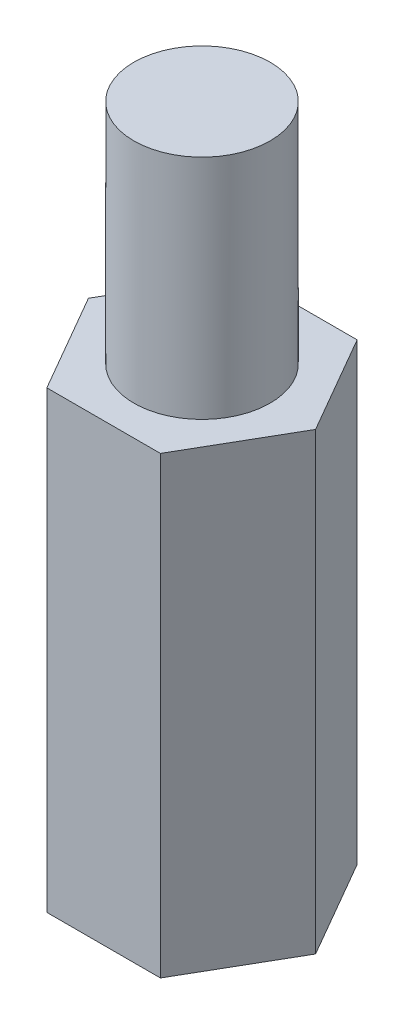
ISO-10303-21;
HEADER;
FILE_DESCRIPTION(('STEP AP214'),'2;1');
FILE_NAME('part.step','',(''),(''),'','','');
FILE_SCHEMA(('AUTOMOTIVE_DESIGN { 1 0 10303 214 1 1 1 1 }'));
ENDSEC;
DATA;
#1=APPLICATION_CONTEXT('core data for automotive mechanical design processes');
#2=APPLICATION_PROTOCOL_DEFINITION('international standard','automotive_design',2000,#1);
#3=PRODUCT_CONTEXT('',#1,'mechanical');
#4=PRODUCT('Part','Part','',(#3));
#5=PRODUCT_RELATED_PRODUCT_CATEGORY('part','',(#4));
#6=PRODUCT_DEFINITION_FORMATION('','',#4);
#7=PRODUCT_DEFINITION_CONTEXT('part definition',#1,'design');
#8=PRODUCT_DEFINITION('design','',#6,#7);
#9=PRODUCT_DEFINITION_SHAPE('','',#8);
#10=(LENGTH_UNIT() NAMED_UNIT(*) SI_UNIT(.MILLI.,.METRE.));
#11=(NAMED_UNIT(*) PLANE_ANGLE_UNIT() SI_UNIT($,.RADIAN.));
#12=(NAMED_UNIT(*) SI_UNIT($,.STERADIAN.) SOLID_ANGLE_UNIT());
#13=UNCERTAINTY_MEASURE_WITH_UNIT(LENGTH_MEASURE(1.E-05),#10,'distance_accuracy_value','');
#14=(GEOMETRIC_REPRESENTATION_CONTEXT(3) GLOBAL_UNCERTAINTY_ASSIGNED_CONTEXT((#13)) GLOBAL_UNIT_ASSIGNED_CONTEXT((#10,
#11,#12)) REPRESENTATION_CONTEXT('',''));
#15=CARTESIAN_POINT('',(0.,0.,0.));
#16=DIRECTION('',(0.,0.,1.));
#17=DIRECTION('',(1.,0.,0.));
#18=AXIS2_PLACEMENT_3D('',#15,#16,#17);
#19=CARTESIAN_POINT('',(0.,10.,0.));
#20=DIRECTION('',(0.,1.,0.));
#21=DIRECTION('',(0.,0.,1.));
#22=AXIS2_PLACEMENT_3D('',#19,#20,#21);
#23=PLANE('',#22);
#24=DIRECTION('',(1.,0.,0.));
#25=VECTOR('',#24,1.);
#26=CARTESIAN_POINT('',(-1.25,10.,2.1650635094611));
#27=LINE('',#26,#25);
#28=CARTESIAN_POINT('',(-1.25,10.,2.1650635094611));
#29=VERTEX_POINT('',#28);
#30=CARTESIAN_POINT('',(1.25,10.,2.1650635094611));
#31=VERTEX_POINT('',#30);
#32=EDGE_CURVE('E91',#29,#31,#27,.T.);
#33=ORIENTED_EDGE('',*,*,#32,.T.);
#34=DIRECTION('',(0.5,0.,-0.866025403784439));
#35=VECTOR('',#34,1.);
#36=CARTESIAN_POINT('',(1.25,10.,2.1650635094611));
#37=LINE('',#36,#35);
#38=CARTESIAN_POINT('',(2.5,10.,0.));
#39=VERTEX_POINT('',#38);
#40=EDGE_CURVE('E84',#31,#39,#37,.T.);
#41=ORIENTED_EDGE('',*,*,#40,.T.);
#42=DIRECTION('',(-0.499999999999999,0.,-0.866025403784439));
#43=VECTOR('',#42,1.);
#44=CARTESIAN_POINT('',(2.5,10.,0.));
#45=LINE('',#44,#43);
#46=CARTESIAN_POINT('',(1.25,10.,-2.1650635094611));
#47=VERTEX_POINT('',#46);
#48=EDGE_CURVE('E88',#39,#47,#45,.T.);
#49=ORIENTED_EDGE('',*,*,#48,.T.);
#50=DIRECTION('',(-1.,0.,0.));
#51=VECTOR('',#50,1.);
#52=CARTESIAN_POINT('',(1.25,10.,-2.1650635094611));
#53=LINE('',#52,#51);
#54=CARTESIAN_POINT('',(-1.25,10.,-2.1650635094611));
#55=VERTEX_POINT('',#54);
#56=EDGE_CURVE('E107',#47,#55,#53,.T.);
#57=ORIENTED_EDGE('',*,*,#56,.T.);
#58=DIRECTION('',(-0.5,0.,0.866025403784438));
#59=VECTOR('',#58,1.);
#60=CARTESIAN_POINT('',(-1.25,10.,-2.1650635094611));
#61=LINE('',#60,#59);
#62=CARTESIAN_POINT('',(-2.5,10.,0.));
#63=VERTEX_POINT('',#62);
#64=EDGE_CURVE('E109',#55,#63,#61,.T.);
#65=ORIENTED_EDGE('',*,*,#64,.T.);
#66=DIRECTION('',(0.499999999999999,0.,0.866025403784439));
#67=VECTOR('',#66,1.);
#68=CARTESIAN_POINT('',(-2.5,10.,0.));
#69=LINE('',#68,#67);
#70=EDGE_CURVE('E114',#63,#29,#69,.T.);
#71=ORIENTED_EDGE('',*,*,#70,.T.);
#72=EDGE_LOOP('',(#33,#41,#49,#57,#65,#71));
#73=FACE_BOUND('',#72,.T.);
#74=CARTESIAN_POINT('',(0.,10.,0.));
#75=DIRECTION('',(0.,-1.,0.));
#76=DIRECTION('',(0.,0.,-1.));
#77=AXIS2_PLACEMENT_3D('',#74,#75,#76);
#78=CIRCLE('',#77,1.5);
#79=CARTESIAN_POINT('',(0.,10.,-1.5));
#80=VERTEX_POINT('',#79);
#81=EDGE_CURVE('E45',#80,#80,#78,.T.);
#82=ORIENTED_EDGE('',*,*,#81,.T.);
#83=EDGE_LOOP('',(#82));
#84=FACE_BOUND('',#83,.T.);
#85=ADVANCED_FACE('F41',(#73,#84),#23,.T.);
#86=CARTESIAN_POINT('',(-1.25,10.,2.1650635094611));
#87=DIRECTION('',(0.,0.,-1.));
#88=DIRECTION('',(-1.,0.,0.));
#89=AXIS2_PLACEMENT_3D('',#86,#87,#88);
#90=PLANE('',#89);
#91=DIRECTION('',(1.,0.,0.));
#92=VECTOR('',#91,1.);
#93=CARTESIAN_POINT('',(-1.25,0.,2.1650635094611));
#94=LINE('',#93,#92);
#95=CARTESIAN_POINT('',(-1.25,0.,2.1650635094611));
#96=VERTEX_POINT('',#95);
#97=CARTESIAN_POINT('',(1.25,0.,2.1650635094611));
#98=VERTEX_POINT('',#97);
#99=EDGE_CURVE('E116',#96,#98,#94,.T.);
#100=ORIENTED_EDGE('',*,*,#99,.T.);
#101=DIRECTION('',(0.,-1.,0.));
#102=VECTOR('',#101,1.);
#103=CARTESIAN_POINT('',(1.25,10.,2.1650635094611));
#104=LINE('',#103,#102);
#105=EDGE_CURVE('E121',#31,#98,#104,.T.);
#106=ORIENTED_EDGE('',*,*,#105,.F.);
#107=ORIENTED_EDGE('',*,*,#32,.F.);
#108=DIRECTION('',(0.,-1.,0.));
#109=VECTOR('',#108,1.);
#110=CARTESIAN_POINT('',(-1.25,10.,2.1650635094611));
#111=LINE('',#110,#109);
#112=EDGE_CURVE('E119',#29,#96,#111,.T.);
#113=ORIENTED_EDGE('',*,*,#112,.T.);
#114=EDGE_LOOP('',(#100,#106,#107,#113));
#115=FACE_BOUND('',#114,.T.);
#116=ADVANCED_FACE('F139',(#115),#90,.F.);
#117=CARTESIAN_POINT('',(1.25,10.,2.1650635094611));
#118=DIRECTION('',(-0.866025403784439,0.,-0.5));
#119=DIRECTION('',(-0.5,0.,0.866025403784439));
#120=AXIS2_PLACEMENT_3D('',#117,#118,#119);
#121=PLANE('',#120);
#122=DIRECTION('',(0.5,0.,-0.866025403784439));
#123=VECTOR('',#122,1.);
#124=CARTESIAN_POINT('',(1.25,0.,2.1650635094611));
#125=LINE('',#124,#123);
#126=CARTESIAN_POINT('',(2.5,0.,0.));
#127=VERTEX_POINT('',#126);
#128=EDGE_CURVE('E59',#98,#127,#125,.T.);
#129=ORIENTED_EDGE('',*,*,#128,.T.);
#130=DIRECTION('',(0.,-1.,0.));
#131=VECTOR('',#130,1.);
#132=CARTESIAN_POINT('',(2.5,10.,0.));
#133=LINE('',#132,#131);
#134=EDGE_CURVE('E96',#39,#127,#133,.T.);
#135=ORIENTED_EDGE('',*,*,#134,.F.);
#136=ORIENTED_EDGE('',*,*,#40,.F.);
#137=ORIENTED_EDGE('',*,*,#105,.T.);
#138=EDGE_LOOP('',(#129,#135,#136,#137));
#139=FACE_BOUND('',#138,.T.);
#140=ADVANCED_FACE('F97',(#139),#121,.F.);
#141=CARTESIAN_POINT('',(2.5,10.,0.));
#142=DIRECTION('',(-0.866025403784439,0.,0.499999999999999));
#143=DIRECTION('',(0.499999999999999,0.,0.866025403784439));
#144=AXIS2_PLACEMENT_3D('',#141,#142,#143);
#145=PLANE('',#144);
#146=DIRECTION('',(-0.499999999999999,0.,-0.866025403784439));
#147=VECTOR('',#146,1.);
#148=CARTESIAN_POINT('',(2.5,0.,0.));
#149=LINE('',#148,#147);
#150=CARTESIAN_POINT('',(1.25,0.,-2.1650635094611));
#151=VERTEX_POINT('',#150);
#152=EDGE_CURVE('E101',#127,#151,#149,.T.);
#153=ORIENTED_EDGE('',*,*,#152,.T.);
#154=DIRECTION('',(0.,-1.,0.));
#155=VECTOR('',#154,1.);
#156=CARTESIAN_POINT('',(1.25,10.,-2.1650635094611));
#157=LINE('',#156,#155);
#158=EDGE_CURVE('E105',#47,#151,#157,.T.);
#159=ORIENTED_EDGE('',*,*,#158,.F.);
#160=ORIENTED_EDGE('',*,*,#48,.F.);
#161=ORIENTED_EDGE('',*,*,#134,.T.);
#162=EDGE_LOOP('',(#153,#159,#160,#161));
#163=FACE_BOUND('',#162,.T.);
#164=ADVANCED_FACE('F103',(#163),#145,.F.);
#165=CARTESIAN_POINT('',(1.25,10.,-2.1650635094611));
#166=DIRECTION('',(0.,0.,1.));
#167=DIRECTION('',(1.,0.,0.));
#168=AXIS2_PLACEMENT_3D('',#165,#166,#167);
#169=PLANE('',#168);
#170=DIRECTION('',(-1.,0.,0.));
#171=VECTOR('',#170,1.);
#172=CARTESIAN_POINT('',(1.25,0.,-2.1650635094611));
#173=LINE('',#172,#171);
#174=CARTESIAN_POINT('',(-1.25,0.,-2.1650635094611));
#175=VERTEX_POINT('',#174);
#176=EDGE_CURVE('E100',#151,#175,#173,.T.);
#177=ORIENTED_EDGE('',*,*,#176,.T.);
#178=DIRECTION('',(0.,-1.,0.));
#179=VECTOR('',#178,1.);
#180=CARTESIAN_POINT('',(-1.25,10.,-2.1650635094611));
#181=LINE('',#180,#179);
#182=EDGE_CURVE('E128',#55,#175,#181,.T.);
#183=ORIENTED_EDGE('',*,*,#182,.F.);
#184=ORIENTED_EDGE('',*,*,#56,.F.);
#185=ORIENTED_EDGE('',*,*,#158,.T.);
#186=EDGE_LOOP('',(#177,#183,#184,#185));
#187=FACE_BOUND('',#186,.T.);
#188=ADVANCED_FACE('F158',(#187),#169,.F.);
#189=CARTESIAN_POINT('',(-1.25,10.,-2.1650635094611));
#190=DIRECTION('',(0.866025403784438,0.,0.5));
#191=DIRECTION('',(0.500000000000001,0.,-0.866025403784438));
#192=AXIS2_PLACEMENT_3D('',#189,#190,#191);
#193=PLANE('',#192);
#194=DIRECTION('',(-0.5,0.,0.866025403784438));
#195=VECTOR('',#194,1.);
#196=CARTESIAN_POINT('',(-1.25,0.,-2.1650635094611));
#197=LINE('',#196,#195);
#198=CARTESIAN_POINT('',(-2.5,0.,0.));
#199=VERTEX_POINT('',#198);
#200=EDGE_CURVE('E125',#175,#199,#197,.T.);
#201=ORIENTED_EDGE('',*,*,#200,.T.);
#202=DIRECTION('',(0.,-1.,0.));
#203=VECTOR('',#202,1.);
#204=CARTESIAN_POINT('',(-2.5,10.,0.));
#205=LINE('',#204,#203);
#206=EDGE_CURVE('E51',#63,#199,#205,.T.);
#207=ORIENTED_EDGE('',*,*,#206,.F.);
#208=ORIENTED_EDGE('',*,*,#64,.F.);
#209=ORIENTED_EDGE('',*,*,#182,.T.);
#210=EDGE_LOOP('',(#201,#207,#208,#209));
#211=FACE_BOUND('',#210,.T.);
#212=ADVANCED_FACE('F153',(#211),#193,.F.);
#213=CARTESIAN_POINT('',(-2.5,10.,0.));
#214=DIRECTION('',(0.866025403784439,0.,-0.499999999999999));
#215=DIRECTION('',(-0.499999999999999,0.,-0.866025403784439));
#216=AXIS2_PLACEMENT_3D('',#213,#214,#215);
#217=PLANE('',#216);
#218=DIRECTION('',(0.499999999999999,0.,0.866025403784439));
#219=VECTOR('',#218,1.);
#220=CARTESIAN_POINT('',(-2.5,0.,0.));
#221=LINE('',#220,#219);
#222=EDGE_CURVE('E129',#199,#96,#221,.T.);
#223=ORIENTED_EDGE('',*,*,#222,.T.);
#224=ORIENTED_EDGE('',*,*,#112,.F.);
#225=ORIENTED_EDGE('',*,*,#70,.F.);
#226=ORIENTED_EDGE('',*,*,#206,.T.);
#227=EDGE_LOOP('',(#223,#224,#225,#226));
#228=FACE_BOUND('',#227,.T.);
#229=ADVANCED_FACE('F148',(#228),#217,.F.);
#230=CARTESIAN_POINT('',(0.,0.,0.));
#231=DIRECTION('',(0.,1.,0.));
#232=DIRECTION('',(0.,0.,1.));
#233=AXIS2_PLACEMENT_3D('',#230,#231,#232);
#234=PLANE('',#233);
#235=CARTESIAN_POINT('',(0.,0.,0.));
#236=DIRECTION('',(0.,-1.,0.));
#237=DIRECTION('',(0.,0.,-1.));
#238=AXIS2_PLACEMENT_3D('',#235,#236,#237);
#239=CIRCLE('',#238,1.5);
#240=CARTESIAN_POINT('',(0.,0.,-1.5));
#241=VERTEX_POINT('',#240);
#242=EDGE_CURVE('E12',#241,#241,#239,.T.);
#243=ORIENTED_EDGE('',*,*,#242,.F.);
#244=EDGE_LOOP('',(#243));
#245=FACE_BOUND('',#244,.T.);
#246=ORIENTED_EDGE('',*,*,#99,.F.);
#247=ORIENTED_EDGE('',*,*,#222,.F.);
#248=ORIENTED_EDGE('',*,*,#200,.F.);
#249=ORIENTED_EDGE('',*,*,#176,.F.);
#250=ORIENTED_EDGE('',*,*,#152,.F.);
#251=ORIENTED_EDGE('',*,*,#128,.F.);
#252=EDGE_LOOP('',(#246,#247,#248,#249,#250,#251));
#253=FACE_BOUND('',#252,.T.);
#254=ADVANCED_FACE('F142',(#245,#253),#234,.F.);
#255=CARTESIAN_POINT('',(0.,10.,0.));
#256=DIRECTION('',(0.,-1.,0.));
#257=DIRECTION('',(0.,0.,-1.));
#258=AXIS2_PLACEMENT_3D('',#255,#256,#257);
#259=CYLINDRICAL_SURFACE('',#258,1.5);
#260=ORIENTED_EDGE('',*,*,#81,.F.);
#261=EDGE_LOOP('',(#260));
#262=FACE_BOUND('',#261,.T.);
#263=ORIENTED_EDGE('',*,*,#242,.T.);
#264=EDGE_LOOP('',(#263));
#265=FACE_BOUND('',#264,.T.);
#266=ADVANCED_FACE('F43',(#262,#265),#259,.F.);
#267=CLOSED_SHELL('',(#85,#116,#140,#164,#188,#212,#229,#254,#266));
#268=MANIFOLD_SOLID_BREP('B2',#267);
#269=CARTESIAN_POINT('',(0.,15.,0.));
#270=DIRECTION('',(0.,1.,0.));
#271=DIRECTION('',(0.,0.,1.));
#272=AXIS2_PLACEMENT_3D('',#269,#270,#271);
#273=PLANE('',#272);
#274=CARTESIAN_POINT('',(0.,15.,0.));
#275=DIRECTION('',(0.,1.,0.));
#276=DIRECTION('',(0.,0.,1.));
#277=AXIS2_PLACEMENT_3D('',#274,#275,#276);
#278=CIRCLE('',#277,1.5);
#279=CARTESIAN_POINT('',(0.,15.,1.5));
#280=VERTEX_POINT('',#279);
#281=EDGE_CURVE('E40',#280,#280,#278,.T.);
#282=ORIENTED_EDGE('',*,*,#281,.T.);
#283=EDGE_LOOP('',(#282));
#284=FACE_BOUND('',#283,.T.);
#285=ADVANCED_FACE('F238',(#284),#273,.T.);
#286=CARTESIAN_POINT('',(0.,15.,0.));
#287=DIRECTION('',(0.,-1.,0.));
#288=DIRECTION('',(0.,0.,-1.));
#289=AXIS2_PLACEMENT_3D('',#286,#287,#288);
#290=CYLINDRICAL_SURFACE('',#289,1.5);
#291=ORIENTED_EDGE('',*,*,#281,.F.);
#292=EDGE_LOOP('',(#291));
#293=FACE_BOUND('',#292,.T.);
#294=CARTESIAN_POINT('',(0.,10.,0.));
#295=DIRECTION('',(0.,-1.,0.));
#296=DIRECTION('',(0.,0.,-1.));
#297=AXIS2_PLACEMENT_3D('',#294,#295,#296);
#298=CIRCLE('',#297,1.5);
#299=CARTESIAN_POINT('',(0.,10.,-1.5));
#300=VERTEX_POINT('',#299);
#301=EDGE_CURVE('E245',#300,#300,#298,.T.);
#302=ORIENTED_EDGE('',*,*,#301,.F.);
#303=EDGE_LOOP('',(#302));
#304=FACE_BOUND('',#303,.T.);
#305=ADVANCED_FACE('F240',(#293,#304),#290,.T.);
#306=CARTESIAN_POINT('',(0.,10.,0.));
#307=DIRECTION('',(0.,-1.,0.));
#308=DIRECTION('',(0.,0.,-1.));
#309=AXIS2_PLACEMENT_3D('',#306,#307,#308);
#310=PLANE('',#309);
#311=ORIENTED_EDGE('',*,*,#301,.T.);
#312=EDGE_LOOP('',(#311));
#313=FACE_BOUND('',#312,.T.);
#314=ADVANCED_FACE('F251',(#313),#310,.T.);
#315=CLOSED_SHELL('',(#285,#305,#314));
#316=MANIFOLD_SOLID_BREP('B6',#315);
#317=ADVANCED_BREP_SHAPE_REPRESENTATION('',(#18,#268,#316),#14);
#318=SHAPE_DEFINITION_REPRESENTATION(#9,#317);
ENDSEC;
END-ISO-10303-21;
